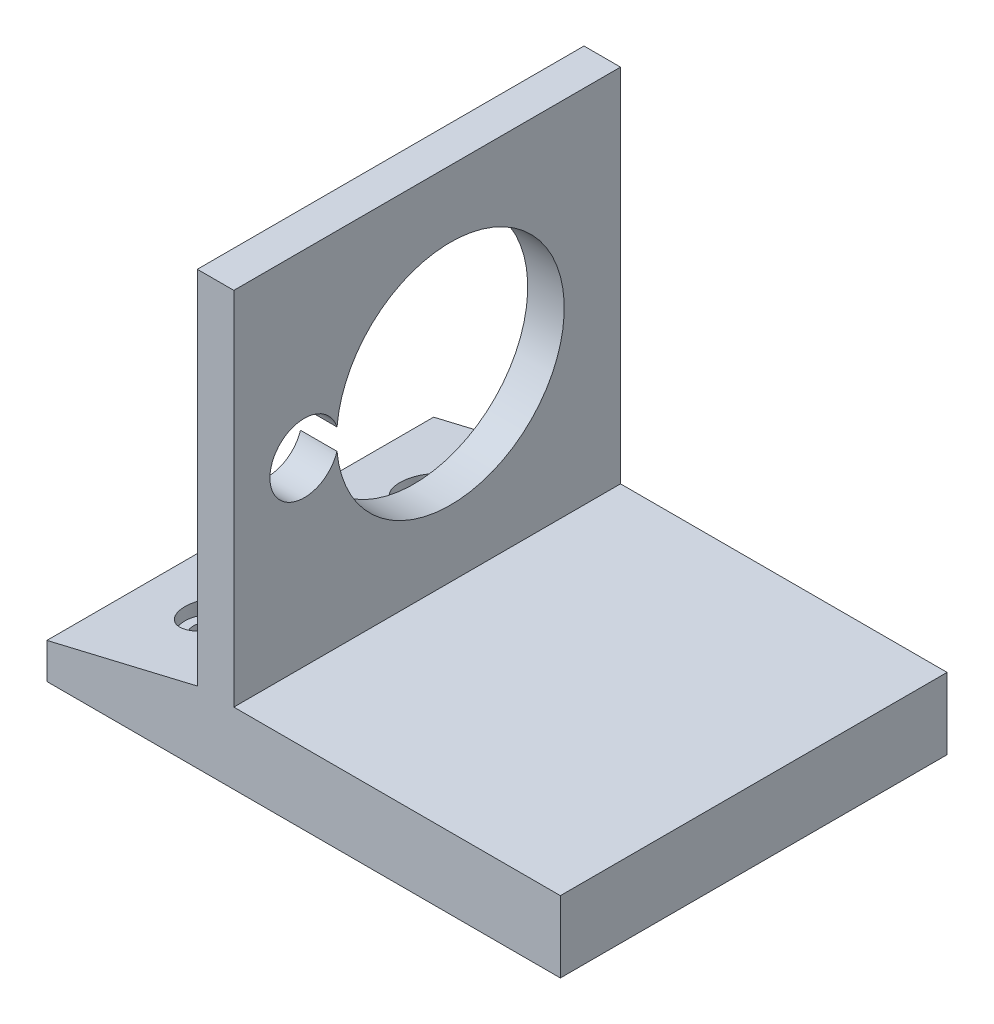
ISO-10303-21;
HEADER;
FILE_DESCRIPTION(('STEP AP214'),'2;1');
FILE_NAME('part.step','',(''),(''),'','','');
FILE_SCHEMA(('AUTOMOTIVE_DESIGN { 1 0 10303 214 1 1 1 1 }'));
ENDSEC;
DATA;
#1=APPLICATION_CONTEXT('core data for automotive mechanical design processes');
#2=APPLICATION_PROTOCOL_DEFINITION('international standard','automotive_design',2000,#1);
#3=PRODUCT_CONTEXT('',#1,'mechanical');
#4=PRODUCT('Part','Part','',(#3));
#5=PRODUCT_RELATED_PRODUCT_CATEGORY('part','',(#4));
#6=PRODUCT_DEFINITION_FORMATION('','',#4);
#7=PRODUCT_DEFINITION_CONTEXT('part definition',#1,'design');
#8=PRODUCT_DEFINITION('design','',#6,#7);
#9=PRODUCT_DEFINITION_SHAPE('','',#8);
#10=(LENGTH_UNIT() NAMED_UNIT(*) SI_UNIT(.MILLI.,.METRE.));
#11=(NAMED_UNIT(*) PLANE_ANGLE_UNIT() SI_UNIT($,.RADIAN.));
#12=(NAMED_UNIT(*) SI_UNIT($,.STERADIAN.) SOLID_ANGLE_UNIT());
#13=UNCERTAINTY_MEASURE_WITH_UNIT(LENGTH_MEASURE(1.E-05),#10,'distance_accuracy_value','');
#14=(GEOMETRIC_REPRESENTATION_CONTEXT(3) GLOBAL_UNCERTAINTY_ASSIGNED_CONTEXT((#13)) GLOBAL_UNIT_ASSIGNED_CONTEXT((#10,
#11,#12)) REPRESENTATION_CONTEXT('',''));
#15=CARTESIAN_POINT('',(0.,0.,0.));
#16=DIRECTION('',(0.,0.,1.));
#17=DIRECTION('',(1.,0.,0.));
#18=AXIS2_PLACEMENT_3D('',#15,#16,#17);
#19=CARTESIAN_POINT('',(-50.6835100710085,-554.760879723169,-10.));
#20=DIRECTION('',(0.,-1.,0.));
#21=DIRECTION('',(0.,0.,-1.));
#22=AXIS2_PLACEMENT_3D('',#19,#20,#21);
#23=CYLINDRICAL_SURFACE('',#22,2.);
#24=CARTESIAN_POINT('',(-50.6835100710085,-605.060879723169,-10.));
#25=DIRECTION('',(0.,-1.,0.));
#26=DIRECTION('',(0.,0.,-1.));
#27=AXIS2_PLACEMENT_3D('',#24,#25,#26);
#28=CIRCLE('',#27,2.);
#29=CARTESIAN_POINT('',(-50.6835100710085,-605.060879723169,-12.));
#30=VERTEX_POINT('',#29);
#31=EDGE_CURVE('E130',#30,#30,#28,.T.);
#32=ORIENTED_EDGE('',*,*,#31,.T.);
#33=EDGE_LOOP('',(#32));
#34=FACE_BOUND('',#33,.T.);
#35=CARTESIAN_POINT('',(-50.6835100710085,-600.910879723169,-10.));
#36=DIRECTION('',(0.,1.,0.));
#37=DIRECTION('',(0.,0.,1.));
#38=AXIS2_PLACEMENT_3D('',#35,#36,#37);
#39=CIRCLE('',#38,2.);
#40=CARTESIAN_POINT('',(-50.6835100710085,-600.910879723169,-8.00000000000004));
#41=VERTEX_POINT('',#40);
#42=EDGE_CURVE('E193',#41,#41,#39,.F.);
#43=ORIENTED_EDGE('',*,*,#42,.F.);
#44=EDGE_LOOP('',(#43));
#45=FACE_BOUND('',#44,.T.);
#46=ADVANCED_FACE('F37',(#34,#45),#23,.F.);
#47=CARTESIAN_POINT('',(-50.6835100710085,-554.760879723169,-35.));
#48=DIRECTION('',(0.,-1.,0.));
#49=DIRECTION('',(0.,0.,-1.));
#50=AXIS2_PLACEMENT_3D('',#47,#48,#49);
#51=CYLINDRICAL_SURFACE('',#50,2.);
#52=CARTESIAN_POINT('',(-50.6835100710085,-605.060879723169,-35.));
#53=DIRECTION('',(0.,-1.,0.));
#54=DIRECTION('',(0.,0.,-1.));
#55=AXIS2_PLACEMENT_3D('',#52,#53,#54);
#56=CIRCLE('',#55,2.);
#57=CARTESIAN_POINT('',(-50.6835100710085,-605.060879723169,-37.));
#58=VERTEX_POINT('',#57);
#59=EDGE_CURVE('E127',#58,#58,#56,.T.);
#60=ORIENTED_EDGE('',*,*,#59,.T.);
#61=EDGE_LOOP('',(#60));
#62=FACE_BOUND('',#61,.T.);
#63=CARTESIAN_POINT('',(-50.6835100710085,-600.910879723169,-35.));
#64=DIRECTION('',(0.,1.,0.));
#65=DIRECTION('',(0.,0.,1.));
#66=AXIS2_PLACEMENT_3D('',#63,#64,#65);
#67=CIRCLE('',#66,2.);
#68=CARTESIAN_POINT('',(-50.6835100710085,-600.910879723169,-33.));
#69=VERTEX_POINT('',#68);
#70=EDGE_CURVE('E190',#69,#69,#67,.F.);
#71=ORIENTED_EDGE('',*,*,#70,.F.);
#72=EDGE_LOOP('',(#71));
#73=FACE_BOUND('',#72,.T.);
#74=ADVANCED_FACE('F262',(#62,#73),#51,.F.);
#75=CARTESIAN_POINT('',(-42.2498204189982,-554.760879723169,-123.102700253565));
#76=DIRECTION('',(0.,1.,0.));
#77=DIRECTION('',(0.,0.,1.));
#78=AXIS2_PLACEMENT_3D('',#75,#76,#77);
#79=PLANE('',#78);
#80=DIRECTION('',(1.,0.,0.));
#81=VECTOR('',#80,1.);
#82=CARTESIAN_POINT('',(-42.2498204189982,-554.760879723169,-45.));
#83=LINE('',#82,#81);
#84=CARTESIAN_POINT('',(-42.2498204189982,-554.760879723169,-45.));
#85=VERTEX_POINT('',#84);
#86=CARTESIAN_POINT('',(-38.,-554.760879723169,-45.));
#87=VERTEX_POINT('',#86);
#88=EDGE_CURVE('E46',#85,#87,#83,.T.);
#89=ORIENTED_EDGE('',*,*,#88,.F.);
#90=DIRECTION('',(0.,0.,1.));
#91=VECTOR('',#90,1.);
#92=CARTESIAN_POINT('',(-42.2498204189982,-554.760879723169,-123.102700253565));
#93=LINE('',#92,#91);
#94=CARTESIAN_POINT('',(-42.2498204189982,-554.760879723169,0.));
#95=VERTEX_POINT('',#94);
#96=EDGE_CURVE('E175',#85,#95,#93,.T.);
#97=ORIENTED_EDGE('',*,*,#96,.T.);
#98=DIRECTION('',(-1.,0.,0.));
#99=VECTOR('',#98,1.);
#100=CARTESIAN_POINT('',(-42.2498204189982,-554.760879723169,0.));
#101=LINE('',#100,#99);
#102=CARTESIAN_POINT('',(-38.,-554.760879723169,0.));
#103=VERTEX_POINT('',#102);
#104=EDGE_CURVE('E137',#103,#95,#101,.T.);
#105=ORIENTED_EDGE('',*,*,#104,.F.);
#106=DIRECTION('',(0.,0.,1.));
#107=VECTOR('',#106,1.);
#108=CARTESIAN_POINT('',(-38.,-554.760879723169,-123.102700253565));
#109=LINE('',#108,#107);
#110=EDGE_CURVE('E141',#87,#103,#109,.T.);
#111=ORIENTED_EDGE('',*,*,#110,.F.);
#112=EDGE_LOOP('',(#89,#97,#105,#111));
#113=FACE_BOUND('',#112,.T.);
#114=ADVANCED_FACE('F39',(#113),#79,.T.);
#115=CARTESIAN_POINT('',(-38.,-554.760879723169,-123.102700253565));
#116=DIRECTION('',(1.,0.,0.));
#117=DIRECTION('',(0.,0.,-1.));
#118=AXIS2_PLACEMENT_3D('',#115,#116,#117);
#119=PLANE('',#118);
#120=CARTESIAN_POINT('',(-38.,-575.760879723169,-25.2000000000001));
#121=DIRECTION('',(1.,0.,0.));
#122=DIRECTION('',(0.,0.,-1.));
#123=AXIS2_PLACEMENT_3D('',#120,#121,#122);
#124=CIRCLE('',#123,13.25);
#125=CARTESIAN_POINT('',(-38.,-576.988423193019,-12.0069852941178));
#126=VERTEX_POINT('',#125);
#127=CARTESIAN_POINT('',(-38.,-574.533336253319,-12.0069852941178));
#128=VERTEX_POINT('',#127);
#129=EDGE_CURVE('E115',#126,#128,#124,.T.);
#130=ORIENTED_EDGE('',*,*,#129,.F.);
#131=CARTESIAN_POINT('',(-38.,-575.760879723169,-8.20000000000013));
#132=DIRECTION('',(1.,0.,0.));
#133=DIRECTION('',(0.,0.,-1.));
#134=AXIS2_PLACEMENT_3D('',#131,#132,#133);
#135=CIRCLE('',#134,3.99999999999995);
#136=EDGE_CURVE('E117',#128,#126,#135,.T.);
#137=ORIENTED_EDGE('',*,*,#136,.F.);
#138=EDGE_LOOP('',(#130,#137));
#139=FACE_BOUND('',#138,.T.);
#140=DIRECTION('',(0.,-1.,0.));
#141=VECTOR('',#140,1.);
#142=CARTESIAN_POINT('',(-38.,-554.760879723169,-45.));
#143=LINE('',#142,#141);
#144=CARTESIAN_POINT('',(-38.,-596.760879723169,-45.));
#145=VERTEX_POINT('',#144);
#146=EDGE_CURVE('E149',#87,#145,#143,.T.);
#147=ORIENTED_EDGE('',*,*,#146,.F.);
#148=ORIENTED_EDGE('',*,*,#110,.T.);
#149=DIRECTION('',(0.,1.,0.));
#150=VECTOR('',#149,1.);
#151=CARTESIAN_POINT('',(-38.,-554.760879723169,0.));
#152=LINE('',#151,#150);
#153=CARTESIAN_POINT('',(-38.,-596.760879723169,0.));
#154=VERTEX_POINT('',#153);
#155=EDGE_CURVE('E172',#154,#103,#152,.T.);
#156=ORIENTED_EDGE('',*,*,#155,.F.);
#157=DIRECTION('',(0.,0.,1.));
#158=VECTOR('',#157,1.);
#159=CARTESIAN_POINT('',(-38.,-596.760879723169,-123.102700253565));
#160=LINE('',#159,#158);
#161=EDGE_CURVE('E177',#145,#154,#160,.T.);
#162=ORIENTED_EDGE('',*,*,#161,.F.);
#163=EDGE_LOOP('',(#147,#148,#156,#162));
#164=FACE_BOUND('',#163,.T.);
#165=ADVANCED_FACE('F247',(#139,#164),#119,.T.);
#166=CARTESIAN_POINT('',(-38.,-596.760879723169,-123.102700253565));
#167=DIRECTION('',(0.,1.,0.));
#168=DIRECTION('',(0.,0.,1.));
#169=AXIS2_PLACEMENT_3D('',#166,#167,#168);
#170=PLANE('',#169);
#171=DIRECTION('',(1.,0.,0.));
#172=VECTOR('',#171,1.);
#173=CARTESIAN_POINT('',(-38.,-596.760879723169,-45.));
#174=LINE('',#173,#172);
#175=CARTESIAN_POINT('',(0.,-596.760879723169,-45.));
#176=VERTEX_POINT('',#175);
#177=EDGE_CURVE('E147',#145,#176,#174,.T.);
#178=ORIENTED_EDGE('',*,*,#177,.F.);
#179=ORIENTED_EDGE('',*,*,#161,.T.);
#180=DIRECTION('',(-1.,0.,0.));
#181=VECTOR('',#180,1.);
#182=CARTESIAN_POINT('',(-38.,-596.760879723169,0.));
#183=LINE('',#182,#181);
#184=CARTESIAN_POINT('',(0.,-596.760879723169,0.));
#185=VERTEX_POINT('',#184);
#186=EDGE_CURVE('E169',#185,#154,#183,.T.);
#187=ORIENTED_EDGE('',*,*,#186,.F.);
#188=DIRECTION('',(0.,0.,1.));
#189=VECTOR('',#188,1.);
#190=CARTESIAN_POINT('',(0.,-596.760879723169,-123.102700253565));
#191=LINE('',#190,#189);
#192=EDGE_CURVE('E179',#176,#185,#191,.T.);
#193=ORIENTED_EDGE('',*,*,#192,.F.);
#194=EDGE_LOOP('',(#178,#179,#187,#193));
#195=FACE_BOUND('',#194,.T.);
#196=ADVANCED_FACE('F251',(#195),#170,.T.);
#197=CARTESIAN_POINT('',(0.,-596.760879723169,-123.102700253565));
#198=DIRECTION('',(1.,0.,0.));
#199=DIRECTION('',(0.,1.,0.));
#200=AXIS2_PLACEMENT_3D('',#197,#198,#199);
#201=PLANE('',#200);
#202=DIRECTION('',(0.,-1.,0.));
#203=VECTOR('',#202,1.);
#204=CARTESIAN_POINT('',(0.,-596.760879723169,-45.));
#205=LINE('',#204,#203);
#206=CARTESIAN_POINT('',(0.,-605.060879723169,-45.));
#207=VERTEX_POINT('',#206);
#208=EDGE_CURVE('E145',#176,#207,#205,.T.);
#209=ORIENTED_EDGE('',*,*,#208,.F.);
#210=ORIENTED_EDGE('',*,*,#192,.T.);
#211=DIRECTION('',(0.,1.,0.));
#212=VECTOR('',#211,1.);
#213=CARTESIAN_POINT('',(0.,-596.760879723169,0.));
#214=LINE('',#213,#212);
#215=CARTESIAN_POINT('',(0.,-605.060879723169,0.));
#216=VERTEX_POINT('',#215);
#217=EDGE_CURVE('E166',#216,#185,#214,.T.);
#218=ORIENTED_EDGE('',*,*,#217,.F.);
#219=DIRECTION('',(0.,0.,1.));
#220=VECTOR('',#219,1.);
#221=CARTESIAN_POINT('',(0.,-605.060879723169,-123.102700253565));
#222=LINE('',#221,#220);
#223=EDGE_CURVE('E181',#207,#216,#222,.T.);
#224=ORIENTED_EDGE('',*,*,#223,.F.);
#225=EDGE_LOOP('',(#209,#210,#218,#224));
#226=FACE_BOUND('',#225,.T.);
#227=ADVANCED_FACE('F212',(#226),#201,.T.);
#228=CARTESIAN_POINT('',(0.,-605.060879723169,-123.102700253565));
#229=DIRECTION('',(0.,-1.,0.));
#230=DIRECTION('',(0.,0.,-1.));
#231=AXIS2_PLACEMENT_3D('',#228,#229,#230);
#232=PLANE('',#231);
#233=ORIENTED_EDGE('',*,*,#59,.F.);
#234=EDGE_LOOP('',(#233));
#235=FACE_BOUND('',#234,.T.);
#236=ORIENTED_EDGE('',*,*,#31,.F.);
#237=EDGE_LOOP('',(#236));
#238=FACE_BOUND('',#237,.T.);
#239=DIRECTION('',(-1.,0.,0.));
#240=VECTOR('',#239,1.);
#241=CARTESIAN_POINT('',(0.,-605.060879723169,-45.));
#242=LINE('',#241,#240);
#243=CARTESIAN_POINT('',(-59.7489898399811,-605.060879723169,-45.));
#244=VERTEX_POINT('',#243);
#245=EDGE_CURVE('E143',#207,#244,#242,.T.);
#246=ORIENTED_EDGE('',*,*,#245,.F.);
#247=ORIENTED_EDGE('',*,*,#223,.T.);
#248=DIRECTION('',(1.,0.,0.));
#249=VECTOR('',#248,1.);
#250=CARTESIAN_POINT('',(0.,-605.060879723169,0.));
#251=LINE('',#250,#249);
#252=CARTESIAN_POINT('',(-59.7489898399811,-605.060879723169,0.));
#253=VERTEX_POINT('',#252);
#254=EDGE_CURVE('E163',#253,#216,#251,.T.);
#255=ORIENTED_EDGE('',*,*,#254,.F.);
#256=DIRECTION('',(0.,0.,1.));
#257=VECTOR('',#256,1.);
#258=CARTESIAN_POINT('',(-59.7489898399811,-605.060879723169,-123.102700253565));
#259=LINE('',#258,#257);
#260=EDGE_CURVE('E183',#244,#253,#259,.T.);
#261=ORIENTED_EDGE('',*,*,#260,.F.);
#262=EDGE_LOOP('',(#246,#247,#255,#261));
#263=FACE_BOUND('',#262,.T.);
#264=ADVANCED_FACE('F208',(#235,#238,#263),#232,.T.);
#265=CARTESIAN_POINT('',(-59.7489898399811,-605.060879723169,-123.102700253565));
#266=DIRECTION('',(-1.,0.,0.));
#267=DIRECTION('',(0.,0.,1.));
#268=AXIS2_PLACEMENT_3D('',#265,#266,#267);
#269=PLANE('',#268);
#270=DIRECTION('',(0.,1.,0.));
#271=VECTOR('',#270,1.);
#272=CARTESIAN_POINT('',(-59.7489898399811,-605.060879723169,-45.));
#273=LINE('',#272,#271);
#274=CARTESIAN_POINT('',(-59.7489898399811,-600.910879723169,-45.));
#275=VERTEX_POINT('',#274);
#276=EDGE_CURVE('E140',#244,#275,#273,.T.);
#277=ORIENTED_EDGE('',*,*,#276,.F.);
#278=ORIENTED_EDGE('',*,*,#260,.T.);
#279=DIRECTION('',(0.,-1.,0.));
#280=VECTOR('',#279,1.);
#281=CARTESIAN_POINT('',(-59.7489898399811,-605.060879723169,0.));
#282=LINE('',#281,#280);
#283=CARTESIAN_POINT('',(-59.7489898399811,-600.910879723169,0.));
#284=VERTEX_POINT('',#283);
#285=EDGE_CURVE('E160',#284,#253,#282,.T.);
#286=ORIENTED_EDGE('',*,*,#285,.F.);
#287=DIRECTION('',(0.,0.,1.));
#288=VECTOR('',#287,1.);
#289=CARTESIAN_POINT('',(-59.7489898399811,-600.910879723169,-123.102700253565));
#290=LINE('',#289,#288);
#291=EDGE_CURVE('E185',#275,#284,#290,.T.);
#292=ORIENTED_EDGE('',*,*,#291,.F.);
#293=EDGE_LOOP('',(#277,#278,#286,#292));
#294=FACE_BOUND('',#293,.T.);
#295=ADVANCED_FACE('F211',(#294),#269,.T.);
#296=CARTESIAN_POINT('',(-59.7489898399811,-600.910879723169,-123.102700253565));
#297=DIRECTION('',(-0.230753836059882,0.973012161868314,0.));
#298=DIRECTION('',(-0.973012161868314,-0.230753836059882,0.));
#299=AXIS2_PLACEMENT_3D('',#296,#297,#298);
#300=PLANE('',#299);
#301=CARTESIAN_POINT('',(-50.6835100710085,-598.760963910815,-35.));
#302=DIRECTION('',(-0.230753836059882,0.973012161868314,0.));
#303=DIRECTION('',(0.973012161868314,0.230753836059882,0.));
#304=AXIS2_PLACEMENT_3D('',#301,#302,#303);
#305=ELLIPSE('',#304,3.08320914945153,3.);
#306=CARTESIAN_POINT('',(-47.6835100710085,-598.049501572204,-35.));
#307=VERTEX_POINT('',#306);
#308=EDGE_CURVE('E41',#307,#307,#305,.T.);
#309=ORIENTED_EDGE('',*,*,#308,.F.);
#310=EDGE_LOOP('',(#309));
#311=FACE_BOUND('',#310,.T.);
#312=CARTESIAN_POINT('',(-50.6835100710085,-598.760963910815,-10.));
#313=DIRECTION('',(-0.230753836059882,0.973012161868314,0.));
#314=DIRECTION('',(0.973012161868314,0.230753836059882,0.));
#315=AXIS2_PLACEMENT_3D('',#312,#313,#314);
#316=ELLIPSE('',#315,3.08320914945153,3.);
#317=CARTESIAN_POINT('',(-47.6835100710085,-598.049501572204,-10.));
#318=VERTEX_POINT('',#317);
#319=EDGE_CURVE('E196',#318,#318,#316,.T.);
#320=ORIENTED_EDGE('',*,*,#319,.F.);
#321=EDGE_LOOP('',(#320));
#322=FACE_BOUND('',#321,.T.);
#323=DIRECTION('',(0.973012161868314,0.230753836059882,0.));
#324=VECTOR('',#323,1.);
#325=CARTESIAN_POINT('',(-59.7489898399811,-600.910879723169,-45.));
#326=LINE('',#325,#324);
#327=CARTESIAN_POINT('',(-42.2498204189982,-596.760879723169,-45.));
#328=VERTEX_POINT('',#327);
#329=EDGE_CURVE('E138',#275,#328,#326,.T.);
#330=ORIENTED_EDGE('',*,*,#329,.F.);
#331=ORIENTED_EDGE('',*,*,#291,.T.);
#332=DIRECTION('',(-0.973012161868314,-0.230753836059882,0.));
#333=VECTOR('',#332,1.);
#334=CARTESIAN_POINT('',(-59.7489898399811,-600.910879723169,0.));
#335=LINE('',#334,#333);
#336=CARTESIAN_POINT('',(-42.2498204189982,-596.760879723169,0.));
#337=VERTEX_POINT('',#336);
#338=EDGE_CURVE('E157',#337,#284,#335,.T.);
#339=ORIENTED_EDGE('',*,*,#338,.F.);
#340=DIRECTION('',(0.,0.,1.));
#341=VECTOR('',#340,1.);
#342=CARTESIAN_POINT('',(-42.2498204189982,-596.760879723169,-123.102700253565));
#343=LINE('',#342,#341);
#344=EDGE_CURVE('E187',#328,#337,#343,.T.);
#345=ORIENTED_EDGE('',*,*,#344,.F.);
#346=EDGE_LOOP('',(#330,#331,#339,#345));
#347=FACE_BOUND('',#346,.T.);
#348=ADVANCED_FACE('F236',(#311,#322,#347),#300,.T.);
#349=CARTESIAN_POINT('',(-42.2498204189982,-596.760879723169,-123.102700253565));
#350=DIRECTION('',(-1.,0.,0.));
#351=DIRECTION('',(0.,0.,1.));
#352=AXIS2_PLACEMENT_3D('',#349,#350,#351);
#353=PLANE('',#352);
#354=CARTESIAN_POINT('',(-42.2498204189982,-575.760879723169,-25.2000000000001));
#355=DIRECTION('',(-1.,0.,0.));
#356=DIRECTION('',(0.,0.,1.));
#357=AXIS2_PLACEMENT_3D('',#354,#355,#356);
#358=CIRCLE('',#357,13.25);
#359=CARTESIAN_POINT('',(-42.2498204189982,-574.533336253319,-12.0069852941178));
#360=VERTEX_POINT('',#359);
#361=CARTESIAN_POINT('',(-42.2498204189982,-576.988423193019,-12.0069852941178));
#362=VERTEX_POINT('',#361);
#363=EDGE_CURVE('E61',#360,#362,#358,.T.);
#364=ORIENTED_EDGE('',*,*,#363,.F.);
#365=CARTESIAN_POINT('',(-42.2498204189982,-575.760879723169,-8.20000000000013));
#366=DIRECTION('',(-1.,0.,0.));
#367=DIRECTION('',(0.,0.,1.));
#368=AXIS2_PLACEMENT_3D('',#365,#366,#367);
#369=CIRCLE('',#368,3.99999999999995);
#370=EDGE_CURVE('E121',#362,#360,#369,.T.);
#371=ORIENTED_EDGE('',*,*,#370,.F.);
#372=EDGE_LOOP('',(#364,#371));
#373=FACE_BOUND('',#372,.T.);
#374=DIRECTION('',(0.,1.,0.));
#375=VECTOR('',#374,1.);
#376=CARTESIAN_POINT('',(-42.2498204189982,-596.760879723169,-45.));
#377=LINE('',#376,#375);
#378=EDGE_CURVE('E11',#328,#85,#377,.T.);
#379=ORIENTED_EDGE('',*,*,#378,.F.);
#380=ORIENTED_EDGE('',*,*,#344,.T.);
#381=DIRECTION('',(0.,-1.,0.));
#382=VECTOR('',#381,1.);
#383=CARTESIAN_POINT('',(-42.2498204189982,-596.760879723169,0.));
#384=LINE('',#383,#382);
#385=EDGE_CURVE('E154',#95,#337,#384,.T.);
#386=ORIENTED_EDGE('',*,*,#385,.F.);
#387=ORIENTED_EDGE('',*,*,#96,.F.);
#388=EDGE_LOOP('',(#379,#380,#386,#387));
#389=FACE_BOUND('',#388,.T.);
#390=ADVANCED_FACE('F125',(#373,#389),#353,.T.);
#391=CARTESIAN_POINT('',(0.,0.,0.));
#392=DIRECTION('',(0.,0.,-1.));
#393=DIRECTION('',(-1.,0.,0.));
#394=AXIS2_PLACEMENT_3D('',#391,#392,#393);
#395=PLANE('',#394);
#396=ORIENTED_EDGE('',*,*,#104,.T.);
#397=ORIENTED_EDGE('',*,*,#385,.T.);
#398=ORIENTED_EDGE('',*,*,#338,.T.);
#399=ORIENTED_EDGE('',*,*,#285,.T.);
#400=ORIENTED_EDGE('',*,*,#254,.T.);
#401=ORIENTED_EDGE('',*,*,#217,.T.);
#402=ORIENTED_EDGE('',*,*,#186,.T.);
#403=ORIENTED_EDGE('',*,*,#155,.T.);
#404=EDGE_LOOP('',(#396,#397,#398,#399,#400,#401,#402,#403));
#405=FACE_BOUND('',#404,.T.);
#406=ADVANCED_FACE('F227',(#405),#395,.F.);
#407=CARTESIAN_POINT('',(0.,-135.651012106187,-45.));
#408=DIRECTION('',(0.,0.,1.));
#409=DIRECTION('',(1.,0.,0.));
#410=AXIS2_PLACEMENT_3D('',#407,#408,#409);
#411=PLANE('',#410);
#412=ORIENTED_EDGE('',*,*,#88,.T.);
#413=ORIENTED_EDGE('',*,*,#146,.T.);
#414=ORIENTED_EDGE('',*,*,#177,.T.);
#415=ORIENTED_EDGE('',*,*,#208,.T.);
#416=ORIENTED_EDGE('',*,*,#245,.T.);
#417=ORIENTED_EDGE('',*,*,#276,.T.);
#418=ORIENTED_EDGE('',*,*,#329,.T.);
#419=ORIENTED_EDGE('',*,*,#378,.T.);
#420=EDGE_LOOP('',(#412,#413,#414,#415,#416,#417,#418,#419));
#421=FACE_BOUND('',#420,.T.);
#422=ADVANCED_FACE('F233',(#421),#411,.F.);
#423=CARTESIAN_POINT('',(0.,-575.760879723169,-25.2000000000001));
#424=DIRECTION('',(-1.,0.,0.));
#425=DIRECTION('',(0.,0.,1.));
#426=AXIS2_PLACEMENT_3D('',#423,#424,#425);
#427=CYLINDRICAL_SURFACE('',#426,13.25);
#428=ORIENTED_EDGE('',*,*,#129,.T.);
#429=DIRECTION('',(-1.,0.,0.));
#430=VECTOR('',#429,1.);
#431=CARTESIAN_POINT('',(0.,-574.533336253319,-12.0069852941178));
#432=LINE('',#431,#430);
#433=EDGE_CURVE('E54',#128,#360,#432,.T.);
#434=ORIENTED_EDGE('',*,*,#433,.T.);
#435=ORIENTED_EDGE('',*,*,#363,.T.);
#436=DIRECTION('',(-1.,0.,0.));
#437=VECTOR('',#436,1.);
#438=CARTESIAN_POINT('',(0.,-576.988423193019,-12.0069852941178));
#439=LINE('',#438,#437);
#440=EDGE_CURVE('E118',#126,#362,#439,.T.);
#441=ORIENTED_EDGE('',*,*,#440,.F.);
#442=EDGE_LOOP('',(#428,#434,#435,#441));
#443=FACE_BOUND('',#442,.T.);
#444=ADVANCED_FACE('F113',(#443),#427,.F.);
#445=CARTESIAN_POINT('',(0.,-575.760879723169,-8.20000000000013));
#446=DIRECTION('',(-1.,0.,0.));
#447=DIRECTION('',(0.,0.,1.));
#448=AXIS2_PLACEMENT_3D('',#445,#446,#447);
#449=CYLINDRICAL_SURFACE('',#448,3.99999999999995);
#450=ORIENTED_EDGE('',*,*,#136,.T.);
#451=ORIENTED_EDGE('',*,*,#440,.T.);
#452=ORIENTED_EDGE('',*,*,#370,.T.);
#453=ORIENTED_EDGE('',*,*,#433,.F.);
#454=EDGE_LOOP('',(#450,#451,#452,#453));
#455=FACE_BOUND('',#454,.T.);
#456=ADVANCED_FACE('F122',(#455),#449,.F.);
#457=CARTESIAN_POINT('',(-50.6835100710085,-600.910879723169,-35.));
#458=DIRECTION('',(0.,1.,0.));
#459=DIRECTION('',(0.,0.,1.));
#460=AXIS2_PLACEMENT_3D('',#457,#458,#459);
#461=PLANE('',#460);
#462=CARTESIAN_POINT('',(-50.6835100710085,-600.910879723169,-35.));
#463=DIRECTION('',(0.,1.,0.));
#464=DIRECTION('',(0.,0.,1.));
#465=AXIS2_PLACEMENT_3D('',#462,#463,#464);
#466=CIRCLE('',#465,3.);
#467=CARTESIAN_POINT('',(-50.6835100710085,-600.910879723169,-32.));
#468=VERTEX_POINT('',#467);
#469=EDGE_CURVE('E194',#468,#468,#466,.T.);
#470=ORIENTED_EDGE('',*,*,#469,.T.);
#471=EDGE_LOOP('',(#470));
#472=FACE_BOUND('',#471,.T.);
#473=ORIENTED_EDGE('',*,*,#70,.T.);
#474=EDGE_LOOP('',(#473));
#475=FACE_BOUND('',#474,.T.);
#476=ADVANCED_FACE('F273',(#472,#475),#461,.T.);
#477=CARTESIAN_POINT('',(-50.6835100710085,-600.910879723169,-35.));
#478=DIRECTION('',(0.,1.,0.));
#479=DIRECTION('',(0.,0.,1.));
#480=AXIS2_PLACEMENT_3D('',#477,#478,#479);
#481=CYLINDRICAL_SURFACE('',#480,3.);
#482=ORIENTED_EDGE('',*,*,#308,.T.);
#483=EDGE_LOOP('',(#482));
#484=FACE_BOUND('',#483,.T.);
#485=ORIENTED_EDGE('',*,*,#469,.F.);
#486=EDGE_LOOP('',(#485));
#487=FACE_BOUND('',#486,.T.);
#488=ADVANCED_FACE('F311',(#484,#487),#481,.F.);
#489=CARTESIAN_POINT('',(-50.6835100710085,-600.910879723169,-10.));
#490=DIRECTION('',(0.,1.,0.));
#491=DIRECTION('',(0.,0.,1.));
#492=AXIS2_PLACEMENT_3D('',#489,#490,#491);
#493=PLANE('',#492);
#494=CARTESIAN_POINT('',(-50.6835100710085,-600.910879723169,-10.));
#495=DIRECTION('',(0.,1.,0.));
#496=DIRECTION('',(0.,0.,1.));
#497=AXIS2_PLACEMENT_3D('',#494,#495,#496);
#498=CIRCLE('',#497,3.);
#499=CARTESIAN_POINT('',(-50.6835100710085,-600.910879723169,-7.00000000000004));
#500=VERTEX_POINT('',#499);
#501=EDGE_CURVE('E346',#500,#500,#498,.T.);
#502=ORIENTED_EDGE('',*,*,#501,.T.);
#503=EDGE_LOOP('',(#502));
#504=FACE_BOUND('',#503,.T.);
#505=ORIENTED_EDGE('',*,*,#42,.T.);
#506=EDGE_LOOP('',(#505));
#507=FACE_BOUND('',#506,.T.);
#508=ADVANCED_FACE('F322',(#504,#507),#493,.T.);
#509=CARTESIAN_POINT('',(-50.6835100710085,-600.910879723169,-10.));
#510=DIRECTION('',(0.,1.,0.));
#511=DIRECTION('',(0.,0.,1.));
#512=AXIS2_PLACEMENT_3D('',#509,#510,#511);
#513=CYLINDRICAL_SURFACE('',#512,3.);
#514=ORIENTED_EDGE('',*,*,#319,.T.);
#515=EDGE_LOOP('',(#514));
#516=FACE_BOUND('',#515,.T.);
#517=ORIENTED_EDGE('',*,*,#501,.F.);
#518=EDGE_LOOP('',(#517));
#519=FACE_BOUND('',#518,.T.);
#520=ADVANCED_FACE('F331',(#516,#519),#513,.F.);
#521=CLOSED_SHELL('',(#46,#74,#114,#165,#196,#227,#264,#295,#348,#390,#406,#422,#444,#456,#476,
#488,#508,#520));
#522=MANIFOLD_SOLID_BREP('B2',#521);
#523=ADVANCED_BREP_SHAPE_REPRESENTATION('',(#18,#522),#14);
#524=SHAPE_DEFINITION_REPRESENTATION(#9,#523);
ENDSEC;
END-ISO-10303-21;
